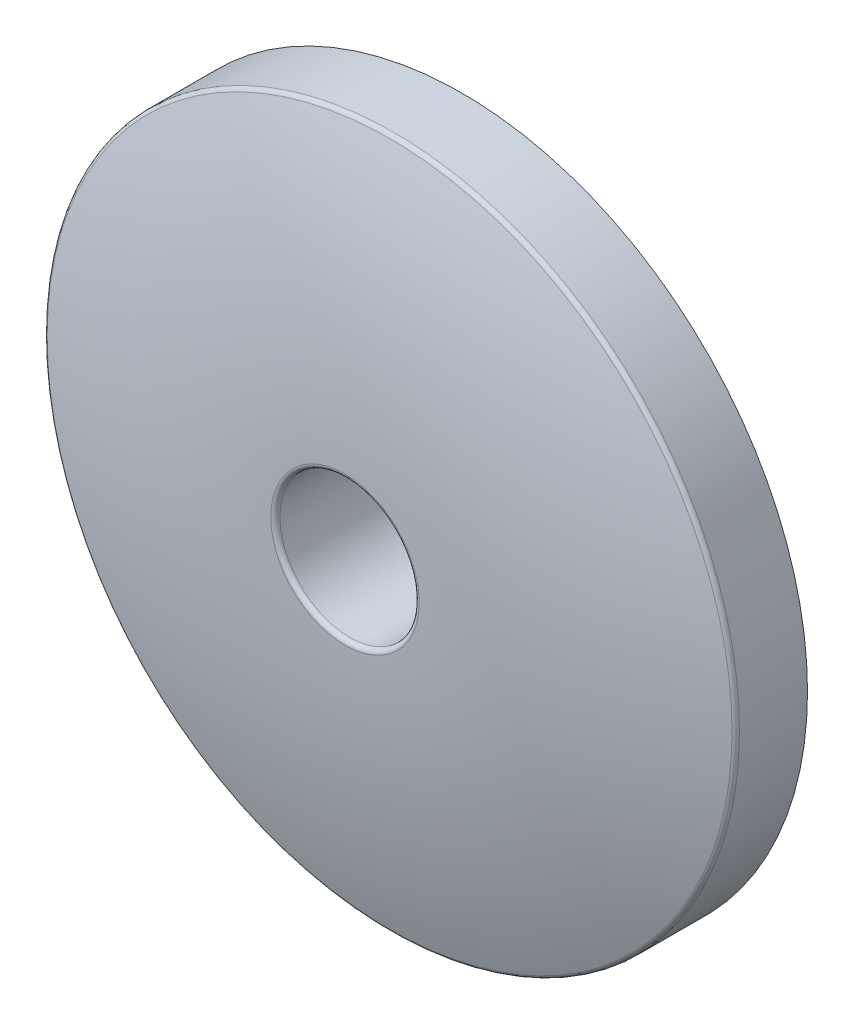
ISO-10303-21;
HEADER;
FILE_DESCRIPTION(('STEP AP214'),'2;1');
FILE_NAME('part.step','',(''),(''),'','','');
FILE_SCHEMA(('AUTOMOTIVE_DESIGN { 1 0 10303 214 1 1 1 1 }'));
ENDSEC;
DATA;
#1=APPLICATION_CONTEXT('core data for automotive mechanical design processes');
#2=APPLICATION_PROTOCOL_DEFINITION('international standard','automotive_design',2000,#1);
#3=PRODUCT_CONTEXT('',#1,'mechanical');
#4=PRODUCT('Part','Part','',(#3));
#5=PRODUCT_RELATED_PRODUCT_CATEGORY('part','',(#4));
#6=PRODUCT_DEFINITION_FORMATION('','',#4);
#7=PRODUCT_DEFINITION_CONTEXT('part definition',#1,'design');
#8=PRODUCT_DEFINITION('design','',#6,#7);
#9=PRODUCT_DEFINITION_SHAPE('','',#8);
#10=(LENGTH_UNIT() NAMED_UNIT(*) SI_UNIT(.MILLI.,.METRE.));
#11=(NAMED_UNIT(*) PLANE_ANGLE_UNIT() SI_UNIT($,.RADIAN.));
#12=(NAMED_UNIT(*) SI_UNIT($,.STERADIAN.) SOLID_ANGLE_UNIT());
#13=UNCERTAINTY_MEASURE_WITH_UNIT(LENGTH_MEASURE(1.E-05),#10,'distance_accuracy_value','');
#14=(GEOMETRIC_REPRESENTATION_CONTEXT(3) GLOBAL_UNCERTAINTY_ASSIGNED_CONTEXT((#13)) GLOBAL_UNIT_ASSIGNED_CONTEXT((#10,
#11,#12)) REPRESENTATION_CONTEXT('',''));
#15=CARTESIAN_POINT('',(0.,0.,0.));
#16=DIRECTION('',(0.,0.,1.));
#17=DIRECTION('',(1.,0.,0.));
#18=AXIS2_PLACEMENT_3D('',#15,#16,#17);
#19=CARTESIAN_POINT('',(38.481,-19.05,-50.8));
#20=DIRECTION('',(0.,0.,-1.));
#21=DIRECTION('',(-1.,0.,0.));
#22=AXIS2_PLACEMENT_3D('',#19,#20,#21);
#23=CYLINDRICAL_SURFACE('',#22,7.747);
#24=CARTESIAN_POINT('',(38.481,-19.05,20.44446));
#25=DIRECTION('',(0.,0.,-1.));
#26=DIRECTION('',(-1.,0.,0.));
#27=AXIS2_PLACEMENT_3D('',#24,#25,#26);
#28=CIRCLE('',#27,7.747);
#29=CARTESIAN_POINT('',(30.734,-19.05,20.44446));
#30=VERTEX_POINT('',#29);
#31=EDGE_CURVE('E63',#30,#30,#28,.T.);
#32=ORIENTED_EDGE('',*,*,#31,.F.);
#33=EDGE_LOOP('',(#32));
#34=FACE_BOUND('',#33,.T.);
#35=CARTESIAN_POINT('',(38.481,-19.05,7.9375));
#36=DIRECTION('',(0.,0.,-1.));
#37=DIRECTION('',(-1.,0.,0.));
#38=AXIS2_PLACEMENT_3D('',#35,#36,#37);
#39=CIRCLE('',#38,7.747);
#40=CARTESIAN_POINT('',(30.734,-19.05,7.9375));
#41=VERTEX_POINT('',#40);
#42=EDGE_CURVE('E10',#41,#41,#39,.T.);
#43=ORIENTED_EDGE('',*,*,#42,.T.);
#44=EDGE_LOOP('',(#43));
#45=FACE_BOUND('',#44,.T.);
#46=ADVANCED_FACE('F41',(#34,#45),#23,.F.);
#47=CARTESIAN_POINT('',(46.228,-19.05,7.9375));
#48=DIRECTION('',(0.,0.,1.));
#49=DIRECTION('',(1.,0.,0.));
#50=AXIS2_PLACEMENT_3D('',#47,#48,#49);
#51=PLANE('',#50);
#52=ORIENTED_EDGE('',*,*,#42,.F.);
#53=EDGE_LOOP('',(#52));
#54=FACE_BOUND('',#53,.T.);
#55=CARTESIAN_POINT('',(38.481,-19.05,7.9375));
#56=DIRECTION('',(0.,0.,-1.));
#57=DIRECTION('',(-1.,0.,0.));
#58=AXIS2_PLACEMENT_3D('',#55,#56,#57);
#59=CIRCLE('',#58,38.44925);
#60=CARTESIAN_POINT('',(0.0317499999999971,-19.05,7.9375));
#61=VERTEX_POINT('',#60);
#62=EDGE_CURVE('E47',#61,#61,#59,.T.);
#63=ORIENTED_EDGE('',*,*,#62,.T.);
#64=EDGE_LOOP('',(#63));
#65=FACE_BOUND('',#64,.T.);
#66=ADVANCED_FACE('F70',(#54,#65),#51,.F.);
#67=CARTESIAN_POINT('',(38.481,-19.05,-50.8));
#68=DIRECTION('',(0.,0.,-1.));
#69=DIRECTION('',(-1.,0.,0.));
#70=AXIS2_PLACEMENT_3D('',#67,#68,#69);
#71=CYLINDRICAL_SURFACE('',#70,38.44925);
#72=ORIENTED_EDGE('',*,*,#62,.F.);
#73=EDGE_LOOP('',(#72));
#74=FACE_BOUND('',#73,.T.);
#75=CARTESIAN_POINT('',(38.481,-19.05,15.50924));
#76=DIRECTION('',(0.,0.,-1.));
#77=DIRECTION('',(-1.,0.,0.));
#78=AXIS2_PLACEMENT_3D('',#75,#76,#77);
#79=CIRCLE('',#78,38.44925);
#80=CARTESIAN_POINT('',(0.0317499999999971,-19.05,15.50924));
#81=VERTEX_POINT('',#80);
#82=EDGE_CURVE('E51',#81,#81,#79,.T.);
#83=ORIENTED_EDGE('',*,*,#82,.T.);
#84=EDGE_LOOP('',(#83));
#85=FACE_BOUND('',#84,.T.);
#86=ADVANCED_FACE('F74',(#74,#85),#71,.T.);
#87=CARTESIAN_POINT('',(38.481,-19.05,15.508417217605));
#88=DIRECTION('',(0.,0.,-1.));
#89=DIRECTION('',(-1.,0.,0.));
#90=AXIS2_PLACEMENT_3D('',#87,#88,#89);
#91=TOROIDAL_SURFACE('',#90,37.9386961176364,0.5105545453401);
#92=ORIENTED_EDGE('',*,*,#82,.F.);
#93=EDGE_LOOP('',(#92));
#94=FACE_BOUND('',#93,.T.);
#95=CARTESIAN_POINT('',(38.481,-19.05,15.9916962579279));
#96=DIRECTION('',(0.,0.,-1.));
#97=DIRECTION('',(-1.,0.,0.));
#98=AXIS2_PLACEMENT_3D('',#95,#96,#97);
#99=CIRCLE('',#98,38.1033391039798);
#100=CARTESIAN_POINT('',(0.37766089602019,-19.05,15.9916962579279));
#101=VERTEX_POINT('',#100);
#102=EDGE_CURVE('E55',#101,#101,#99,.T.);
#103=ORIENTED_EDGE('',*,*,#102,.T.);
#104=EDGE_LOOP('',(#103));
#105=FACE_BOUND('',#104,.T.);
#106=ADVANCED_FACE('F79',(#94,#105),#91,.T.);
#107=CARTESIAN_POINT('',(38.481,-19.05,-74.363580000001));
#108=DIRECTION('',(0.,0.,-1.));
#109=DIRECTION('',(-1.,0.,0.));
#110=AXIS2_PLACEMENT_3D('',#107,#108,#109);
#111=DEGENERATE_TOROIDAL_SURFACE('',#110,7.74699999999973,95.318326000001,.T.);
#112=ORIENTED_EDGE('',*,*,#102,.F.);
#113=EDGE_LOOP('',(#112));
#114=FACE_BOUND('',#113,.T.);
#115=CARTESIAN_POINT('',(38.481,-19.05,20.95337772262));
#116=DIRECTION('',(0.,0.,-1.));
#117=DIRECTION('',(-1.,0.,0.));
#118=AXIS2_PLACEMENT_3D('',#115,#116,#117);
#119=CIRCLE('',#118,8.25772688057986);
#120=CARTESIAN_POINT('',(30.2232731194201,-19.05,20.95337772262));
#121=VERTEX_POINT('',#120);
#122=EDGE_CURVE('E60',#121,#121,#119,.T.);
#123=ORIENTED_EDGE('',*,*,#122,.T.);
#124=EDGE_LOOP('',(#123));
#125=FACE_BOUND('',#124,.T.);
#126=ADVANCED_FACE('F85',(#114,#125),#111,.T.);
#127=CARTESIAN_POINT('',(38.481,-19.05,20.4460290189909));
#128=DIRECTION('',(0.,0.,-1.));
#129=DIRECTION('',(-1.,0.,0.));
#130=AXIS2_PLACEMENT_3D('',#127,#128,#129);
#131=TOROIDAL_SURFACE('',#130,8.25435746590422,0.507359892018816);
#132=ORIENTED_EDGE('',*,*,#122,.F.);
#133=EDGE_LOOP('',(#132));
#134=FACE_BOUND('',#133,.T.);
#135=ORIENTED_EDGE('',*,*,#31,.T.);
#136=EDGE_LOOP('',(#135));
#137=FACE_BOUND('',#136,.T.);
#138=ADVANCED_FACE('F67',(#134,#137),#131,.T.);
#139=CLOSED_SHELL('',(#46,#66,#86,#106,#126,#138));
#140=MANIFOLD_SOLID_BREP('B2',#139);
#141=ADVANCED_BREP_SHAPE_REPRESENTATION('',(#18,#140),#14);
#142=SHAPE_DEFINITION_REPRESENTATION(#9,#141);
ENDSEC;
END-ISO-10303-21;
